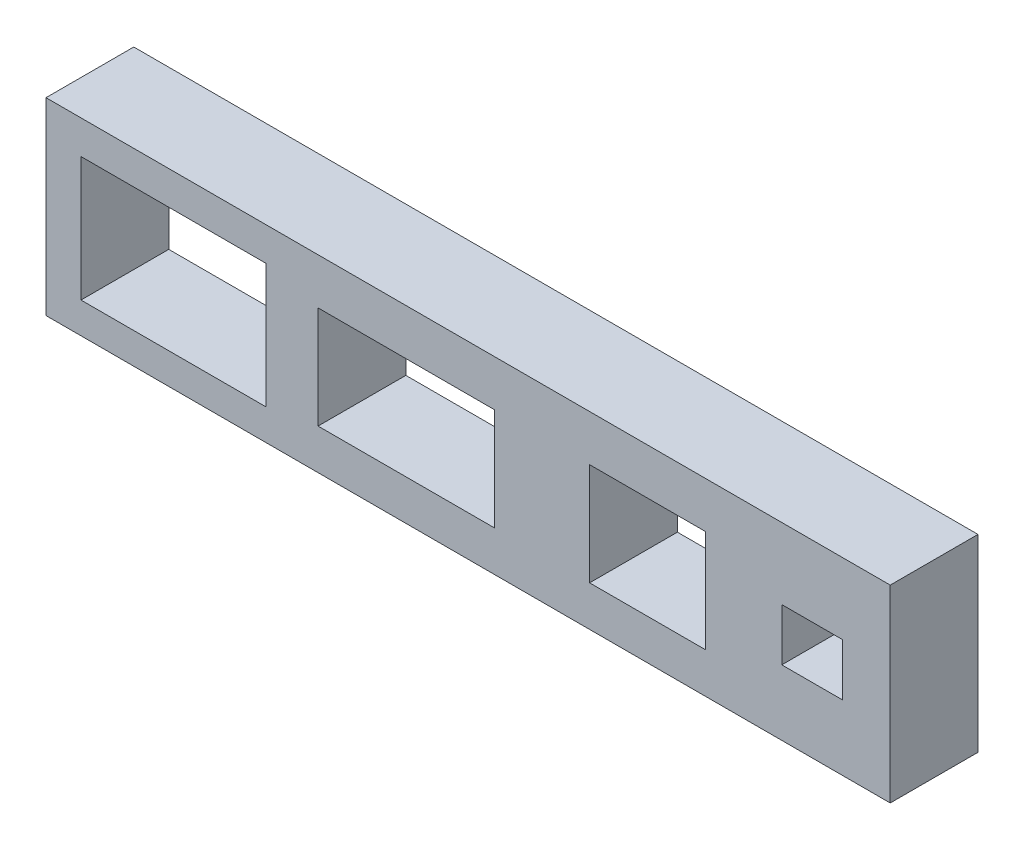
ISO-10303-21;
HEADER;
FILE_DESCRIPTION(('STEP AP214'),'2;1');
FILE_NAME('part.step','',(''),(''),'','','');
FILE_SCHEMA(('AUTOMOTIVE_DESIGN { 1 0 10303 214 1 1 1 1 }'));
ENDSEC;
DATA;
#1=APPLICATION_CONTEXT('core data for automotive mechanical design processes');
#2=APPLICATION_PROTOCOL_DEFINITION('international standard','automotive_design',2000,#1);
#3=PRODUCT_CONTEXT('',#1,'mechanical');
#4=PRODUCT('Part','Part','',(#3));
#5=PRODUCT_RELATED_PRODUCT_CATEGORY('part','',(#4));
#6=PRODUCT_DEFINITION_FORMATION('','',#4);
#7=PRODUCT_DEFINITION_CONTEXT('part definition',#1,'design');
#8=PRODUCT_DEFINITION('design','',#6,#7);
#9=PRODUCT_DEFINITION_SHAPE('','',#8);
#10=(LENGTH_UNIT() NAMED_UNIT(*) SI_UNIT(.MILLI.,.METRE.));
#11=(NAMED_UNIT(*) PLANE_ANGLE_UNIT() SI_UNIT($,.RADIAN.));
#12=(NAMED_UNIT(*) SI_UNIT($,.STERADIAN.) SOLID_ANGLE_UNIT());
#13=UNCERTAINTY_MEASURE_WITH_UNIT(LENGTH_MEASURE(1.E-05),#10,'distance_accuracy_value','');
#14=(GEOMETRIC_REPRESENTATION_CONTEXT(3) GLOBAL_UNCERTAINTY_ASSIGNED_CONTEXT((#13)) GLOBAL_UNIT_ASSIGNED_CONTEXT((#10,
#11,#12)) REPRESENTATION_CONTEXT('',''));
#15=CARTESIAN_POINT('',(0.,0.,0.));
#16=DIRECTION('',(0.,0.,1.));
#17=DIRECTION('',(1.,0.,0.));
#18=AXIS2_PLACEMENT_3D('',#15,#16,#17);
#19=CARTESIAN_POINT('',(0.,0.,10.));
#20=DIRECTION('',(0.,0.,-1.));
#21=DIRECTION('',(-1.,0.,0.));
#22=AXIS2_PLACEMENT_3D('',#19,#20,#21);
#23=PLANE('',#22);
#24=DIRECTION('',(0.,-1.,0.));
#25=VECTOR('',#24,1.);
#26=CARTESIAN_POINT('',(61.9293034987226,16.2583202077266,10.));
#27=LINE('',#26,#25);
#28=CARTESIAN_POINT('',(61.9293034987226,16.2583202077266,10.));
#29=VERTEX_POINT('',#28);
#30=CARTESIAN_POINT('',(61.9293034987226,4.59824889376859,10.));
#31=VERTEX_POINT('',#30);
#32=EDGE_CURVE('E206',#29,#31,#27,.T.);
#33=ORIENTED_EDGE('',*,*,#32,.F.);
#34=DIRECTION('',(-1.,0.,0.));
#35=VECTOR('',#34,1.);
#36=CARTESIAN_POINT('',(61.9293034987226,16.2583202077266,10.));
#37=LINE('',#36,#35);
#38=CARTESIAN_POINT('',(75.136118966573,16.2583202077266,10.));
#39=VERTEX_POINT('',#38);
#40=EDGE_CURVE('E214',#39,#29,#37,.T.);
#41=ORIENTED_EDGE('',*,*,#40,.F.);
#42=DIRECTION('',(0.,1.,0.));
#43=VECTOR('',#42,1.);
#44=CARTESIAN_POINT('',(75.136118966573,16.2583202077266,10.));
#45=LINE('',#44,#43);
#46=CARTESIAN_POINT('',(75.136118966573,4.59824889376859,10.));
#47=VERTEX_POINT('',#46);
#48=EDGE_CURVE('E211',#47,#39,#45,.T.);
#49=ORIENTED_EDGE('',*,*,#48,.F.);
#50=DIRECTION('',(1.,0.,0.));
#51=VECTOR('',#50,1.);
#52=CARTESIAN_POINT('',(61.9293034987226,4.59824889376859,10.));
#53=LINE('',#52,#51);
#54=EDGE_CURVE('E208',#31,#47,#53,.T.);
#55=ORIENTED_EDGE('',*,*,#54,.F.);
#56=EDGE_LOOP('',(#33,#41,#49,#55));
#57=FACE_BOUND('',#56,.T.);
#58=DIRECTION('',(0.,-1.,0.));
#59=VECTOR('',#58,1.);
#60=CARTESIAN_POINT('',(3.98588788752316,17.6860840420888,10.));
#61=LINE('',#60,#59);
#62=CARTESIAN_POINT('',(3.98588788752316,17.6860840420888,10.));
#63=VERTEX_POINT('',#62);
#64=CARTESIAN_POINT('',(3.98588788752316,3.52742601799692,10.));
#65=VERTEX_POINT('',#64);
#66=EDGE_CURVE('E268',#63,#65,#61,.T.);
#67=ORIENTED_EDGE('',*,*,#66,.F.);
#68=DIRECTION('',(-1.,0.,0.));
#69=VECTOR('',#68,1.);
#70=CARTESIAN_POINT('',(3.98588788752316,17.6860840420888,10.));
#71=LINE('',#70,#69);
#72=CARTESIAN_POINT('',(25.0454044443657,17.6860840420888,10.));
#73=VERTEX_POINT('',#72);
#74=EDGE_CURVE('E276',#73,#63,#71,.T.);
#75=ORIENTED_EDGE('',*,*,#74,.F.);
#76=DIRECTION('',(0.,1.,0.));
#77=VECTOR('',#76,1.);
#78=CARTESIAN_POINT('',(25.0454044443657,17.6860840420888,10.));
#79=LINE('',#78,#77);
#80=CARTESIAN_POINT('',(25.0454044443657,3.52742601799692,10.));
#81=VERTEX_POINT('',#80);
#82=EDGE_CURVE('E273',#81,#73,#79,.T.);
#83=ORIENTED_EDGE('',*,*,#82,.F.);
#84=DIRECTION('',(1.,0.,0.));
#85=VECTOR('',#84,1.);
#86=CARTESIAN_POINT('',(3.98588788752316,3.52742601799692,10.));
#87=LINE('',#86,#85);
#88=EDGE_CURVE('E270',#65,#81,#87,.T.);
#89=ORIENTED_EDGE('',*,*,#88,.F.);
#90=EDGE_LOOP('',(#67,#75,#83,#89));
#91=FACE_BOUND('',#90,.T.);
#92=DIRECTION('',(0.,-1.,0.));
#93=VECTOR('',#92,1.);
#94=CARTESIAN_POINT('',(0.,0.,10.));
#95=LINE('',#94,#93);
#96=CARTESIAN_POINT('',(0.,21.5003753753754,10.));
#97=VERTEX_POINT('',#96);
#98=CARTESIAN_POINT('',(0.,0.,10.));
#99=VERTEX_POINT('',#98);
#100=EDGE_CURVE('E299',#97,#99,#95,.T.);
#101=ORIENTED_EDGE('',*,*,#100,.T.);
#102=DIRECTION('',(1.,0.,0.));
#103=VECTOR('',#102,1.);
#104=CARTESIAN_POINT('',(0.,0.,10.));
#105=LINE('',#104,#103);
#106=CARTESIAN_POINT('',(96.1748498498499,0.,10.));
#107=VERTEX_POINT('',#106);
#108=EDGE_CURVE('E302',#99,#107,#105,.T.);
#109=ORIENTED_EDGE('',*,*,#108,.T.);
#110=DIRECTION('',(0.,1.,0.));
#111=VECTOR('',#110,1.);
#112=CARTESIAN_POINT('',(96.1748498498499,0.,10.));
#113=LINE('',#112,#111);
#114=CARTESIAN_POINT('',(96.1748498498499,21.5003753753754,10.));
#115=VERTEX_POINT('',#114);
#116=EDGE_CURVE('E305',#107,#115,#113,.T.);
#117=ORIENTED_EDGE('',*,*,#116,.T.);
#118=DIRECTION('',(-1.,0.,0.));
#119=VECTOR('',#118,1.);
#120=CARTESIAN_POINT('',(0.,21.5003753753754,10.));
#121=LINE('',#120,#119);
#122=EDGE_CURVE('E307',#115,#97,#121,.T.);
#123=ORIENTED_EDGE('',*,*,#122,.T.);
#124=EDGE_LOOP('',(#101,#109,#117,#123));
#125=FACE_BOUND('',#124,.T.);
#126=DIRECTION('',(0.,-1.,0.));
#127=VECTOR('',#126,1.);
#128=CARTESIAN_POINT('',(30.9944204208749,16.2583202077266,10.));
#129=LINE('',#128,#127);
#130=CARTESIAN_POINT('',(30.9944204208749,16.2583202077266,10.));
#131=VERTEX_POINT('',#130);
#132=CARTESIAN_POINT('',(30.9944204208749,4.59824889376859,10.));
#133=VERTEX_POINT('',#132);
#134=EDGE_CURVE('E237',#131,#133,#129,.T.);
#135=ORIENTED_EDGE('',*,*,#134,.F.);
#136=DIRECTION('',(-1.,0.,0.));
#137=VECTOR('',#136,1.);
#138=CARTESIAN_POINT('',(30.9944204208749,16.2583202077266,10.));
#139=LINE('',#138,#137);
#140=CARTESIAN_POINT('',(51.1020944214759,16.2583202077266,10.));
#141=VERTEX_POINT('',#140);
#142=EDGE_CURVE('E245',#141,#131,#139,.T.);
#143=ORIENTED_EDGE('',*,*,#142,.F.);
#144=DIRECTION('',(0.,1.,0.));
#145=VECTOR('',#144,1.);
#146=CARTESIAN_POINT('',(51.1020944214759,16.2583202077266,10.));
#147=LINE('',#146,#145);
#148=CARTESIAN_POINT('',(51.1020944214759,4.59824889376859,10.));
#149=VERTEX_POINT('',#148);
#150=EDGE_CURVE('E242',#149,#141,#147,.T.);
#151=ORIENTED_EDGE('',*,*,#150,.F.);
#152=DIRECTION('',(1.,0.,0.));
#153=VECTOR('',#152,1.);
#154=CARTESIAN_POINT('',(30.9944204208749,4.59824889376859,10.));
#155=LINE('',#154,#153);
#156=EDGE_CURVE('E239',#133,#149,#155,.T.);
#157=ORIENTED_EDGE('',*,*,#156,.F.);
#158=EDGE_LOOP('',(#135,#143,#151,#157));
#159=FACE_BOUND('',#158,.T.);
#160=DIRECTION('',(0.,-1.,0.));
#161=VECTOR('',#160,1.);
#162=CARTESIAN_POINT('',(83.8216822922764,13.4027925390022,10.));
#163=LINE('',#162,#161);
#164=CARTESIAN_POINT('',(83.8216822922764,13.4027925390022,10.));
#165=VERTEX_POINT('',#164);
#166=CARTESIAN_POINT('',(83.8216822922764,7.45377656249299,10.));
#167=VERTEX_POINT('',#166);
#168=EDGE_CURVE('E170',#165,#167,#163,.T.);
#169=ORIENTED_EDGE('',*,*,#168,.F.);
#170=DIRECTION('',(-1.,0.,0.));
#171=VECTOR('',#170,1.);
#172=CARTESIAN_POINT('',(83.8216822922764,13.4027925390022,10.));
#173=LINE('',#172,#171);
#174=CARTESIAN_POINT('',(90.7225408250271,13.4027925390022,10.));
#175=VERTEX_POINT('',#174);
#176=EDGE_CURVE('E192',#175,#165,#173,.T.);
#177=ORIENTED_EDGE('',*,*,#176,.F.);
#178=DIRECTION('',(0.,1.,0.));
#179=VECTOR('',#178,1.);
#180=CARTESIAN_POINT('',(90.7225408250271,13.4027925390022,10.));
#181=LINE('',#180,#179);
#182=CARTESIAN_POINT('',(90.7225408250271,7.45377656249299,10.));
#183=VERTEX_POINT('',#182);
#184=EDGE_CURVE('E190',#183,#175,#181,.T.);
#185=ORIENTED_EDGE('',*,*,#184,.F.);
#186=DIRECTION('',(1.,0.,0.));
#187=VECTOR('',#186,1.);
#188=CARTESIAN_POINT('',(83.8216822922764,7.45377656249299,10.));
#189=LINE('',#188,#187);
#190=EDGE_CURVE('E178',#167,#183,#189,.T.);
#191=ORIENTED_EDGE('',*,*,#190,.F.);
#192=EDGE_LOOP('',(#169,#177,#185,#191));
#193=FACE_BOUND('',#192,.T.);
#194=ADVANCED_FACE('F33',(#57,#91,#125,#159,#193),#23,.F.);
#195=CARTESIAN_POINT('',(0.,0.,0.));
#196=DIRECTION('',(0.,0.,-1.));
#197=DIRECTION('',(-1.,0.,0.));
#198=AXIS2_PLACEMENT_3D('',#195,#196,#197);
#199=PLANE('',#198);
#200=DIRECTION('',(0.,-1.,0.));
#201=VECTOR('',#200,1.);
#202=CARTESIAN_POINT('',(0.,0.,0.));
#203=LINE('',#202,#201);
#204=CARTESIAN_POINT('',(0.,21.5003753753754,0.));
#205=VERTEX_POINT('',#204);
#206=CARTESIAN_POINT('',(0.,0.,0.));
#207=VERTEX_POINT('',#206);
#208=EDGE_CURVE('E298',#205,#207,#203,.T.);
#209=ORIENTED_EDGE('',*,*,#208,.F.);
#210=DIRECTION('',(-1.,0.,0.));
#211=VECTOR('',#210,1.);
#212=CARTESIAN_POINT('',(0.,21.5003753753754,0.));
#213=LINE('',#212,#211);
#214=CARTESIAN_POINT('',(96.1748498498499,21.5003753753754,0.));
#215=VERTEX_POINT('',#214);
#216=EDGE_CURVE('E303',#215,#205,#213,.T.);
#217=ORIENTED_EDGE('',*,*,#216,.F.);
#218=DIRECTION('',(0.,1.,0.));
#219=VECTOR('',#218,1.);
#220=CARTESIAN_POINT('',(96.1748498498499,0.,0.));
#221=LINE('',#220,#219);
#222=CARTESIAN_POINT('',(96.1748498498499,0.,0.));
#223=VERTEX_POINT('',#222);
#224=EDGE_CURVE('E314',#223,#215,#221,.T.);
#225=ORIENTED_EDGE('',*,*,#224,.F.);
#226=DIRECTION('',(1.,0.,0.));
#227=VECTOR('',#226,1.);
#228=CARTESIAN_POINT('',(0.,0.,0.));
#229=LINE('',#228,#227);
#230=EDGE_CURVE('E312',#207,#223,#229,.T.);
#231=ORIENTED_EDGE('',*,*,#230,.F.);
#232=EDGE_LOOP('',(#209,#217,#225,#231));
#233=FACE_BOUND('',#232,.T.);
#234=DIRECTION('',(-1.,0.,0.));
#235=VECTOR('',#234,1.);
#236=CARTESIAN_POINT('',(3.98588788752316,17.6860840420888,0.));
#237=LINE('',#236,#235);
#238=CARTESIAN_POINT('',(25.0454044443657,17.6860840420888,0.));
#239=VERTEX_POINT('',#238);
#240=CARTESIAN_POINT('',(3.98588788752316,17.6860840420888,0.));
#241=VERTEX_POINT('',#240);
#242=EDGE_CURVE('E271',#239,#241,#237,.T.);
#243=ORIENTED_EDGE('',*,*,#242,.T.);
#244=DIRECTION('',(0.,-1.,0.));
#245=VECTOR('',#244,1.);
#246=CARTESIAN_POINT('',(3.98588788752316,17.6860840420888,0.));
#247=LINE('',#246,#245);
#248=CARTESIAN_POINT('',(3.98588788752316,3.52742601799692,0.));
#249=VERTEX_POINT('',#248);
#250=EDGE_CURVE('E267',#241,#249,#247,.T.);
#251=ORIENTED_EDGE('',*,*,#250,.T.);
#252=DIRECTION('',(1.,0.,0.));
#253=VECTOR('',#252,1.);
#254=CARTESIAN_POINT('',(3.98588788752316,3.52742601799692,0.));
#255=LINE('',#254,#253);
#256=CARTESIAN_POINT('',(25.0454044443657,3.52742601799692,0.));
#257=VERTEX_POINT('',#256);
#258=EDGE_CURVE('E281',#249,#257,#255,.T.);
#259=ORIENTED_EDGE('',*,*,#258,.T.);
#260=DIRECTION('',(0.,1.,0.));
#261=VECTOR('',#260,1.);
#262=CARTESIAN_POINT('',(25.0454044443657,17.6860840420888,0.));
#263=LINE('',#262,#261);
#264=EDGE_CURVE('E284',#257,#239,#263,.T.);
#265=ORIENTED_EDGE('',*,*,#264,.T.);
#266=EDGE_LOOP('',(#243,#251,#259,#265));
#267=FACE_BOUND('',#266,.T.);
#268=DIRECTION('',(-1.,0.,0.));
#269=VECTOR('',#268,1.);
#270=CARTESIAN_POINT('',(30.9944204208749,16.2583202077266,0.));
#271=LINE('',#270,#269);
#272=CARTESIAN_POINT('',(51.1020944214759,16.2583202077266,0.));
#273=VERTEX_POINT('',#272);
#274=CARTESIAN_POINT('',(30.9944204208749,16.2583202077266,0.));
#275=VERTEX_POINT('',#274);
#276=EDGE_CURVE('E240',#273,#275,#271,.T.);
#277=ORIENTED_EDGE('',*,*,#276,.T.);
#278=DIRECTION('',(0.,-1.,0.));
#279=VECTOR('',#278,1.);
#280=CARTESIAN_POINT('',(30.9944204208749,16.2583202077266,0.));
#281=LINE('',#280,#279);
#282=CARTESIAN_POINT('',(30.9944204208749,4.59824889376859,0.));
#283=VERTEX_POINT('',#282);
#284=EDGE_CURVE('E236',#275,#283,#281,.T.);
#285=ORIENTED_EDGE('',*,*,#284,.T.);
#286=DIRECTION('',(1.,0.,0.));
#287=VECTOR('',#286,1.);
#288=CARTESIAN_POINT('',(30.9944204208749,4.59824889376859,0.));
#289=LINE('',#288,#287);
#290=CARTESIAN_POINT('',(51.1020944214759,4.59824889376859,0.));
#291=VERTEX_POINT('',#290);
#292=EDGE_CURVE('E250',#283,#291,#289,.T.);
#293=ORIENTED_EDGE('',*,*,#292,.T.);
#294=DIRECTION('',(0.,1.,0.));
#295=VECTOR('',#294,1.);
#296=CARTESIAN_POINT('',(51.1020944214759,16.2583202077266,0.));
#297=LINE('',#296,#295);
#298=EDGE_CURVE('E253',#291,#273,#297,.T.);
#299=ORIENTED_EDGE('',*,*,#298,.T.);
#300=EDGE_LOOP('',(#277,#285,#293,#299));
#301=FACE_BOUND('',#300,.T.);
#302=DIRECTION('',(-1.,0.,0.));
#303=VECTOR('',#302,1.);
#304=CARTESIAN_POINT('',(61.9293034987226,16.2583202077266,0.));
#305=LINE('',#304,#303);
#306=CARTESIAN_POINT('',(75.136118966573,16.2583202077266,0.));
#307=VERTEX_POINT('',#306);
#308=CARTESIAN_POINT('',(61.9293034987226,16.2583202077266,0.));
#309=VERTEX_POINT('',#308);
#310=EDGE_CURVE('E209',#307,#309,#305,.T.);
#311=ORIENTED_EDGE('',*,*,#310,.T.);
#312=DIRECTION('',(0.,-1.,0.));
#313=VECTOR('',#312,1.);
#314=CARTESIAN_POINT('',(61.9293034987226,16.2583202077266,0.));
#315=LINE('',#314,#313);
#316=CARTESIAN_POINT('',(61.9293034987226,4.59824889376859,0.));
#317=VERTEX_POINT('',#316);
#318=EDGE_CURVE('E186',#309,#317,#315,.T.);
#319=ORIENTED_EDGE('',*,*,#318,.T.);
#320=DIRECTION('',(1.,0.,0.));
#321=VECTOR('',#320,1.);
#322=CARTESIAN_POINT('',(61.9293034987226,4.59824889376859,0.));
#323=LINE('',#322,#321);
#324=CARTESIAN_POINT('',(75.136118966573,4.59824889376859,0.));
#325=VERTEX_POINT('',#324);
#326=EDGE_CURVE('E219',#317,#325,#323,.T.);
#327=ORIENTED_EDGE('',*,*,#326,.T.);
#328=DIRECTION('',(0.,1.,0.));
#329=VECTOR('',#328,1.);
#330=CARTESIAN_POINT('',(75.136118966573,16.2583202077266,0.));
#331=LINE('',#330,#329);
#332=EDGE_CURVE('E222',#325,#307,#331,.T.);
#333=ORIENTED_EDGE('',*,*,#332,.T.);
#334=EDGE_LOOP('',(#311,#319,#327,#333));
#335=FACE_BOUND('',#334,.T.);
#336=DIRECTION('',(-1.,0.,0.));
#337=VECTOR('',#336,1.);
#338=CARTESIAN_POINT('',(83.8216822922764,13.4027925390022,0.));
#339=LINE('',#338,#337);
#340=CARTESIAN_POINT('',(90.7225408250271,13.4027925390022,0.));
#341=VERTEX_POINT('',#340);
#342=CARTESIAN_POINT('',(83.8216822922764,13.4027925390022,0.));
#343=VERTEX_POINT('',#342);
#344=EDGE_CURVE('E179',#341,#343,#339,.T.);
#345=ORIENTED_EDGE('',*,*,#344,.T.);
#346=DIRECTION('',(0.,-1.,0.));
#347=VECTOR('',#346,1.);
#348=CARTESIAN_POINT('',(83.8216822922764,13.4027925390022,0.));
#349=LINE('',#348,#347);
#350=CARTESIAN_POINT('',(83.8216822922764,7.45377656249299,0.));
#351=VERTEX_POINT('',#350);
#352=EDGE_CURVE('E56',#343,#351,#349,.T.);
#353=ORIENTED_EDGE('',*,*,#352,.T.);
#354=DIRECTION('',(1.,0.,0.));
#355=VECTOR('',#354,1.);
#356=CARTESIAN_POINT('',(83.8216822922764,7.45377656249299,0.));
#357=LINE('',#356,#355);
#358=CARTESIAN_POINT('',(90.7225408250271,7.45377656249299,0.));
#359=VERTEX_POINT('',#358);
#360=EDGE_CURVE('E185',#351,#359,#357,.T.);
#361=ORIENTED_EDGE('',*,*,#360,.T.);
#362=DIRECTION('',(0.,1.,0.));
#363=VECTOR('',#362,1.);
#364=CARTESIAN_POINT('',(90.7225408250271,13.4027925390022,0.));
#365=LINE('',#364,#363);
#366=EDGE_CURVE('E198',#359,#341,#365,.T.);
#367=ORIENTED_EDGE('',*,*,#366,.T.);
#368=EDGE_LOOP('',(#345,#353,#361,#367));
#369=FACE_BOUND('',#368,.T.);
#370=ADVANCED_FACE('F332',(#233,#267,#301,#335,#369),#199,.T.);
#371=CARTESIAN_POINT('',(0.,0.,10.));
#372=DIRECTION('',(1.,0.,0.));
#373=DIRECTION('',(0.,0.,-1.));
#374=AXIS2_PLACEMENT_3D('',#371,#372,#373);
#375=PLANE('',#374);
#376=ORIENTED_EDGE('',*,*,#208,.T.);
#377=DIRECTION('',(0.,0.,-1.));
#378=VECTOR('',#377,1.);
#379=CARTESIAN_POINT('',(0.,0.,10.));
#380=LINE('',#379,#378);
#381=EDGE_CURVE('E11',#99,#207,#380,.T.);
#382=ORIENTED_EDGE('',*,*,#381,.F.);
#383=ORIENTED_EDGE('',*,*,#100,.F.);
#384=DIRECTION('',(0.,0.,-1.));
#385=VECTOR('',#384,1.);
#386=CARTESIAN_POINT('',(0.,21.5003753753754,10.));
#387=LINE('',#386,#385);
#388=EDGE_CURVE('E309',#97,#205,#387,.T.);
#389=ORIENTED_EDGE('',*,*,#388,.T.);
#390=EDGE_LOOP('',(#376,#382,#383,#389));
#391=FACE_BOUND('',#390,.T.);
#392=ADVANCED_FACE('F35',(#391),#375,.F.);
#393=CARTESIAN_POINT('',(0.,0.,10.));
#394=DIRECTION('',(0.,1.,0.));
#395=DIRECTION('',(0.,0.,1.));
#396=AXIS2_PLACEMENT_3D('',#393,#394,#395);
#397=PLANE('',#396);
#398=ORIENTED_EDGE('',*,*,#230,.T.);
#399=DIRECTION('',(0.,0.,-1.));
#400=VECTOR('',#399,1.);
#401=CARTESIAN_POINT('',(96.1748498498499,0.,10.));
#402=LINE('',#401,#400);
#403=EDGE_CURVE('E41',#107,#223,#402,.T.);
#404=ORIENTED_EDGE('',*,*,#403,.F.);
#405=ORIENTED_EDGE('',*,*,#108,.F.);
#406=ORIENTED_EDGE('',*,*,#381,.T.);
#407=EDGE_LOOP('',(#398,#404,#405,#406));
#408=FACE_BOUND('',#407,.T.);
#409=ADVANCED_FACE('F343',(#408),#397,.F.);
#410=CARTESIAN_POINT('',(96.1748498498499,0.,10.));
#411=DIRECTION('',(-1.,0.,0.));
#412=DIRECTION('',(0.,0.,1.));
#413=AXIS2_PLACEMENT_3D('',#410,#411,#412);
#414=PLANE('',#413);
#415=ORIENTED_EDGE('',*,*,#224,.T.);
#416=DIRECTION('',(0.,0.,-1.));
#417=VECTOR('',#416,1.);
#418=CARTESIAN_POINT('',(96.1748498498499,21.5003753753754,10.));
#419=LINE('',#418,#417);
#420=EDGE_CURVE('E319',#115,#215,#419,.T.);
#421=ORIENTED_EDGE('',*,*,#420,.F.);
#422=ORIENTED_EDGE('',*,*,#116,.F.);
#423=ORIENTED_EDGE('',*,*,#403,.T.);
#424=EDGE_LOOP('',(#415,#421,#422,#423));
#425=FACE_BOUND('',#424,.T.);
#426=ADVANCED_FACE('F326',(#425),#414,.F.);
#427=CARTESIAN_POINT('',(0.,21.5003753753754,10.));
#428=DIRECTION('',(0.,-1.,0.));
#429=DIRECTION('',(0.,0.,-1.));
#430=AXIS2_PLACEMENT_3D('',#427,#428,#429);
#431=PLANE('',#430);
#432=ORIENTED_EDGE('',*,*,#216,.T.);
#433=ORIENTED_EDGE('',*,*,#388,.F.);
#434=ORIENTED_EDGE('',*,*,#122,.F.);
#435=ORIENTED_EDGE('',*,*,#420,.T.);
#436=EDGE_LOOP('',(#432,#433,#434,#435));
#437=FACE_BOUND('',#436,.T.);
#438=ADVANCED_FACE('F336',(#437),#431,.F.);
#439=CARTESIAN_POINT('',(3.98588788752316,17.6860840420888,10.));
#440=DIRECTION('',(1.,0.,0.));
#441=DIRECTION('',(0.,0.,-1.));
#442=AXIS2_PLACEMENT_3D('',#439,#440,#441);
#443=PLANE('',#442);
#444=ORIENTED_EDGE('',*,*,#250,.F.);
#445=DIRECTION('',(0.,0.,-1.));
#446=VECTOR('',#445,1.);
#447=CARTESIAN_POINT('',(3.98588788752316,17.6860840420888,10.));
#448=LINE('',#447,#446);
#449=EDGE_CURVE('E278',#63,#241,#448,.T.);
#450=ORIENTED_EDGE('',*,*,#449,.F.);
#451=ORIENTED_EDGE('',*,*,#66,.T.);
#452=DIRECTION('',(0.,0.,-1.));
#453=VECTOR('',#452,1.);
#454=CARTESIAN_POINT('',(3.98588788752316,3.52742601799692,10.));
#455=LINE('',#454,#453);
#456=EDGE_CURVE('E295',#65,#249,#455,.T.);
#457=ORIENTED_EDGE('',*,*,#456,.T.);
#458=EDGE_LOOP('',(#444,#450,#451,#457));
#459=FACE_BOUND('',#458,.T.);
#460=ADVANCED_FACE('F360',(#459),#443,.T.);
#461=CARTESIAN_POINT('',(3.98588788752316,3.52742601799692,10.));
#462=DIRECTION('',(0.,1.,0.));
#463=DIRECTION('',(0.,0.,1.));
#464=AXIS2_PLACEMENT_3D('',#461,#462,#463);
#465=PLANE('',#464);
#466=ORIENTED_EDGE('',*,*,#258,.F.);
#467=ORIENTED_EDGE('',*,*,#456,.F.);
#468=ORIENTED_EDGE('',*,*,#88,.T.);
#469=DIRECTION('',(0.,0.,-1.));
#470=VECTOR('',#469,1.);
#471=CARTESIAN_POINT('',(25.0454044443657,3.52742601799692,10.));
#472=LINE('',#471,#470);
#473=EDGE_CURVE('E293',#81,#257,#472,.T.);
#474=ORIENTED_EDGE('',*,*,#473,.T.);
#475=EDGE_LOOP('',(#466,#467,#468,#474));
#476=FACE_BOUND('',#475,.T.);
#477=ADVANCED_FACE('F367',(#476),#465,.T.);
#478=CARTESIAN_POINT('',(25.0454044443657,17.6860840420888,10.));
#479=DIRECTION('',(-1.,0.,0.));
#480=DIRECTION('',(0.,0.,1.));
#481=AXIS2_PLACEMENT_3D('',#478,#479,#480);
#482=PLANE('',#481);
#483=ORIENTED_EDGE('',*,*,#264,.F.);
#484=ORIENTED_EDGE('',*,*,#473,.F.);
#485=ORIENTED_EDGE('',*,*,#82,.T.);
#486=DIRECTION('',(0.,0.,-1.));
#487=VECTOR('',#486,1.);
#488=CARTESIAN_POINT('',(25.0454044443657,17.6860840420888,10.));
#489=LINE('',#488,#487);
#490=EDGE_CURVE('E291',#73,#239,#489,.T.);
#491=ORIENTED_EDGE('',*,*,#490,.T.);
#492=EDGE_LOOP('',(#483,#484,#485,#491));
#493=FACE_BOUND('',#492,.T.);
#494=ADVANCED_FACE('F372',(#493),#482,.T.);
#495=CARTESIAN_POINT('',(3.98588788752316,17.6860840420888,10.));
#496=DIRECTION('',(0.,-1.,0.));
#497=DIRECTION('',(0.,0.,-1.));
#498=AXIS2_PLACEMENT_3D('',#495,#496,#497);
#499=PLANE('',#498);
#500=ORIENTED_EDGE('',*,*,#242,.F.);
#501=ORIENTED_EDGE('',*,*,#490,.F.);
#502=ORIENTED_EDGE('',*,*,#74,.T.);
#503=ORIENTED_EDGE('',*,*,#449,.T.);
#504=EDGE_LOOP('',(#500,#501,#502,#503));
#505=FACE_BOUND('',#504,.T.);
#506=ADVANCED_FACE('F379',(#505),#499,.T.);
#507=CARTESIAN_POINT('',(30.9944204208749,16.2583202077266,10.));
#508=DIRECTION('',(1.,0.,0.));
#509=DIRECTION('',(0.,0.,-1.));
#510=AXIS2_PLACEMENT_3D('',#507,#508,#509);
#511=PLANE('',#510);
#512=ORIENTED_EDGE('',*,*,#284,.F.);
#513=DIRECTION('',(0.,0.,-1.));
#514=VECTOR('',#513,1.);
#515=CARTESIAN_POINT('',(30.9944204208749,16.2583202077266,10.));
#516=LINE('',#515,#514);
#517=EDGE_CURVE('E247',#131,#275,#516,.T.);
#518=ORIENTED_EDGE('',*,*,#517,.F.);
#519=ORIENTED_EDGE('',*,*,#134,.T.);
#520=DIRECTION('',(0.,0.,-1.));
#521=VECTOR('',#520,1.);
#522=CARTESIAN_POINT('',(30.9944204208749,4.59824889376859,10.));
#523=LINE('',#522,#521);
#524=EDGE_CURVE('E264',#133,#283,#523,.T.);
#525=ORIENTED_EDGE('',*,*,#524,.T.);
#526=EDGE_LOOP('',(#512,#518,#519,#525));
#527=FACE_BOUND('',#526,.T.);
#528=ADVANCED_FACE('F392',(#527),#511,.T.);
#529=CARTESIAN_POINT('',(30.9944204208749,4.59824889376859,10.));
#530=DIRECTION('',(0.,1.,0.));
#531=DIRECTION('',(0.,0.,1.));
#532=AXIS2_PLACEMENT_3D('',#529,#530,#531);
#533=PLANE('',#532);
#534=ORIENTED_EDGE('',*,*,#292,.F.);
#535=ORIENTED_EDGE('',*,*,#524,.F.);
#536=ORIENTED_EDGE('',*,*,#156,.T.);
#537=DIRECTION('',(0.,0.,-1.));
#538=VECTOR('',#537,1.);
#539=CARTESIAN_POINT('',(51.1020944214759,4.59824889376859,10.));
#540=LINE('',#539,#538);
#541=EDGE_CURVE('E262',#149,#291,#540,.T.);
#542=ORIENTED_EDGE('',*,*,#541,.T.);
#543=EDGE_LOOP('',(#534,#535,#536,#542));
#544=FACE_BOUND('',#543,.T.);
#545=ADVANCED_FACE('F397',(#544),#533,.T.);
#546=CARTESIAN_POINT('',(51.1020944214759,16.2583202077266,10.));
#547=DIRECTION('',(-1.,0.,0.));
#548=DIRECTION('',(0.,0.,1.));
#549=AXIS2_PLACEMENT_3D('',#546,#547,#548);
#550=PLANE('',#549);
#551=ORIENTED_EDGE('',*,*,#298,.F.);
#552=ORIENTED_EDGE('',*,*,#541,.F.);
#553=ORIENTED_EDGE('',*,*,#150,.T.);
#554=DIRECTION('',(0.,0.,-1.));
#555=VECTOR('',#554,1.);
#556=CARTESIAN_POINT('',(51.1020944214759,16.2583202077266,10.));
#557=LINE('',#556,#555);
#558=EDGE_CURVE('E260',#141,#273,#557,.T.);
#559=ORIENTED_EDGE('',*,*,#558,.T.);
#560=EDGE_LOOP('',(#551,#552,#553,#559));
#561=FACE_BOUND('',#560,.T.);
#562=ADVANCED_FACE('F401',(#561),#550,.T.);
#563=CARTESIAN_POINT('',(30.9944204208749,16.2583202077266,10.));
#564=DIRECTION('',(0.,-1.,0.));
#565=DIRECTION('',(0.,0.,-1.));
#566=AXIS2_PLACEMENT_3D('',#563,#564,#565);
#567=PLANE('',#566);
#568=ORIENTED_EDGE('',*,*,#276,.F.);
#569=ORIENTED_EDGE('',*,*,#558,.F.);
#570=ORIENTED_EDGE('',*,*,#142,.T.);
#571=ORIENTED_EDGE('',*,*,#517,.T.);
#572=EDGE_LOOP('',(#568,#569,#570,#571));
#573=FACE_BOUND('',#572,.T.);
#574=ADVANCED_FACE('F405',(#573),#567,.T.);
#575=CARTESIAN_POINT('',(61.9293034987226,16.2583202077266,10.));
#576=DIRECTION('',(1.,0.,0.));
#577=DIRECTION('',(0.,0.,-1.));
#578=AXIS2_PLACEMENT_3D('',#575,#576,#577);
#579=PLANE('',#578);
#580=ORIENTED_EDGE('',*,*,#318,.F.);
#581=DIRECTION('',(0.,0.,-1.));
#582=VECTOR('',#581,1.);
#583=CARTESIAN_POINT('',(61.9293034987226,16.2583202077266,10.));
#584=LINE('',#583,#582);
#585=EDGE_CURVE('E216',#29,#309,#584,.T.);
#586=ORIENTED_EDGE('',*,*,#585,.F.);
#587=ORIENTED_EDGE('',*,*,#32,.T.);
#588=DIRECTION('',(0.,0.,-1.));
#589=VECTOR('',#588,1.);
#590=CARTESIAN_POINT('',(61.9293034987226,4.59824889376859,10.));
#591=LINE('',#590,#589);
#592=EDGE_CURVE('E233',#31,#317,#591,.T.);
#593=ORIENTED_EDGE('',*,*,#592,.T.);
#594=EDGE_LOOP('',(#580,#586,#587,#593));
#595=FACE_BOUND('',#594,.T.);
#596=ADVANCED_FACE('F409',(#595),#579,.T.);
#597=CARTESIAN_POINT('',(61.9293034987226,4.59824889376859,10.));
#598=DIRECTION('',(0.,1.,0.));
#599=DIRECTION('',(0.,0.,1.));
#600=AXIS2_PLACEMENT_3D('',#597,#598,#599);
#601=PLANE('',#600);
#602=ORIENTED_EDGE('',*,*,#326,.F.);
#603=ORIENTED_EDGE('',*,*,#592,.F.);
#604=ORIENTED_EDGE('',*,*,#54,.T.);
#605=DIRECTION('',(0.,0.,-1.));
#606=VECTOR('',#605,1.);
#607=CARTESIAN_POINT('',(75.136118966573,4.59824889376859,10.));
#608=LINE('',#607,#606);
#609=EDGE_CURVE('E231',#47,#325,#608,.T.);
#610=ORIENTED_EDGE('',*,*,#609,.T.);
#611=EDGE_LOOP('',(#602,#603,#604,#610));
#612=FACE_BOUND('',#611,.T.);
#613=ADVANCED_FACE('F413',(#612),#601,.T.);
#614=CARTESIAN_POINT('',(75.136118966573,16.2583202077266,10.));
#615=DIRECTION('',(-1.,0.,0.));
#616=DIRECTION('',(0.,0.,1.));
#617=AXIS2_PLACEMENT_3D('',#614,#615,#616);
#618=PLANE('',#617);
#619=ORIENTED_EDGE('',*,*,#332,.F.);
#620=ORIENTED_EDGE('',*,*,#609,.F.);
#621=ORIENTED_EDGE('',*,*,#48,.T.);
#622=DIRECTION('',(0.,0.,-1.));
#623=VECTOR('',#622,1.);
#624=CARTESIAN_POINT('',(75.136118966573,16.2583202077266,10.));
#625=LINE('',#624,#623);
#626=EDGE_CURVE('E229',#39,#307,#625,.T.);
#627=ORIENTED_EDGE('',*,*,#626,.T.);
#628=EDGE_LOOP('',(#619,#620,#621,#627));
#629=FACE_BOUND('',#628,.T.);
#630=ADVANCED_FACE('F417',(#629),#618,.T.);
#631=CARTESIAN_POINT('',(61.9293034987226,16.2583202077266,10.));
#632=DIRECTION('',(0.,-1.,0.));
#633=DIRECTION('',(0.,0.,-1.));
#634=AXIS2_PLACEMENT_3D('',#631,#632,#633);
#635=PLANE('',#634);
#636=ORIENTED_EDGE('',*,*,#310,.F.);
#637=ORIENTED_EDGE('',*,*,#626,.F.);
#638=ORIENTED_EDGE('',*,*,#40,.T.);
#639=ORIENTED_EDGE('',*,*,#585,.T.);
#640=EDGE_LOOP('',(#636,#637,#638,#639));
#641=FACE_BOUND('',#640,.T.);
#642=ADVANCED_FACE('F421',(#641),#635,.T.);
#643=CARTESIAN_POINT('',(83.8216822922764,13.4027925390022,10.));
#644=DIRECTION('',(1.,0.,0.));
#645=DIRECTION('',(0.,0.,-1.));
#646=AXIS2_PLACEMENT_3D('',#643,#644,#645);
#647=PLANE('',#646);
#648=ORIENTED_EDGE('',*,*,#352,.F.);
#649=DIRECTION('',(0.,0.,-1.));
#650=VECTOR('',#649,1.);
#651=CARTESIAN_POINT('',(83.8216822922764,13.4027925390022,10.));
#652=LINE('',#651,#650);
#653=EDGE_CURVE('E174',#165,#343,#652,.T.);
#654=ORIENTED_EDGE('',*,*,#653,.F.);
#655=ORIENTED_EDGE('',*,*,#168,.T.);
#656=DIRECTION('',(0.,0.,-1.));
#657=VECTOR('',#656,1.);
#658=CARTESIAN_POINT('',(83.8216822922764,7.45377656249299,10.));
#659=LINE('',#658,#657);
#660=EDGE_CURVE('E173',#167,#351,#659,.T.);
#661=ORIENTED_EDGE('',*,*,#660,.T.);
#662=EDGE_LOOP('',(#648,#654,#655,#661));
#663=FACE_BOUND('',#662,.T.);
#664=ADVANCED_FACE('F172',(#663),#647,.T.);
#665=CARTESIAN_POINT('',(83.8216822922764,7.45377656249299,10.));
#666=DIRECTION('',(0.,1.,0.));
#667=DIRECTION('',(0.,0.,1.));
#668=AXIS2_PLACEMENT_3D('',#665,#666,#667);
#669=PLANE('',#668);
#670=ORIENTED_EDGE('',*,*,#360,.F.);
#671=ORIENTED_EDGE('',*,*,#660,.F.);
#672=ORIENTED_EDGE('',*,*,#190,.T.);
#673=DIRECTION('',(0.,0.,-1.));
#674=VECTOR('',#673,1.);
#675=CARTESIAN_POINT('',(90.7225408250271,7.45377656249299,10.));
#676=LINE('',#675,#674);
#677=EDGE_CURVE('E187',#183,#359,#676,.T.);
#678=ORIENTED_EDGE('',*,*,#677,.T.);
#679=EDGE_LOOP('',(#670,#671,#672,#678));
#680=FACE_BOUND('',#679,.T.);
#681=ADVANCED_FACE('F182',(#680),#669,.T.);
#682=CARTESIAN_POINT('',(90.7225408250271,13.4027925390022,10.));
#683=DIRECTION('',(-1.,0.,0.));
#684=DIRECTION('',(0.,0.,1.));
#685=AXIS2_PLACEMENT_3D('',#682,#683,#684);
#686=PLANE('',#685);
#687=ORIENTED_EDGE('',*,*,#366,.F.);
#688=ORIENTED_EDGE('',*,*,#677,.F.);
#689=ORIENTED_EDGE('',*,*,#184,.T.);
#690=DIRECTION('',(0.,0.,-1.));
#691=VECTOR('',#690,1.);
#692=CARTESIAN_POINT('',(90.7225408250271,13.4027925390022,10.));
#693=LINE('',#692,#691);
#694=EDGE_CURVE('E48',#175,#341,#693,.T.);
#695=ORIENTED_EDGE('',*,*,#694,.T.);
#696=EDGE_LOOP('',(#687,#688,#689,#695));
#697=FACE_BOUND('',#696,.T.);
#698=ADVANCED_FACE('F430',(#697),#686,.T.);
#699=CARTESIAN_POINT('',(83.8216822922764,13.4027925390022,10.));
#700=DIRECTION('',(0.,-1.,0.));
#701=DIRECTION('',(0.,0.,-1.));
#702=AXIS2_PLACEMENT_3D('',#699,#700,#701);
#703=PLANE('',#702);
#704=ORIENTED_EDGE('',*,*,#344,.F.);
#705=ORIENTED_EDGE('',*,*,#694,.F.);
#706=ORIENTED_EDGE('',*,*,#176,.T.);
#707=ORIENTED_EDGE('',*,*,#653,.T.);
#708=EDGE_LOOP('',(#704,#705,#706,#707));
#709=FACE_BOUND('',#708,.T.);
#710=ADVANCED_FACE('F433',(#709),#703,.T.);
#711=CLOSED_SHELL('',(#194,#370,#392,#409,#426,#438,#460,#477,#494,#506,#528,#545,#562,#574,
#596,#613,#630,#642,#664,#681,#698,#710));
#712=MANIFOLD_SOLID_BREP('B2',#711);
#713=ADVANCED_BREP_SHAPE_REPRESENTATION('',(#18,#712),#14);
#714=SHAPE_DEFINITION_REPRESENTATION(#9,#713);
ENDSEC;
END-ISO-10303-21;
